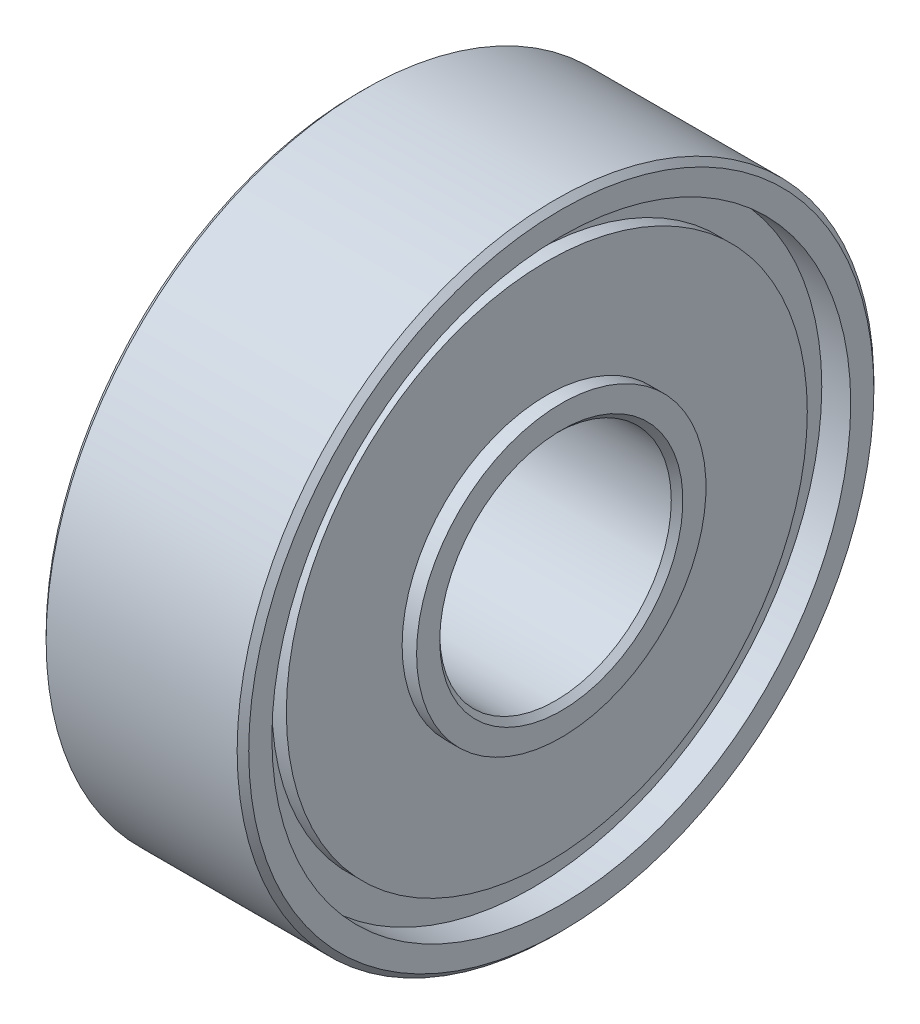
ISO-10303-21;
HEADER;
FILE_DESCRIPTION(('STEP AP214'),'2;1');
FILE_NAME('part.step','',(''),(''),'','','');
FILE_SCHEMA(('AUTOMOTIVE_DESIGN { 1 0 10303 214 1 1 1 1 }'));
ENDSEC;
DATA;
#1=APPLICATION_CONTEXT('core data for automotive mechanical design processes');
#2=APPLICATION_PROTOCOL_DEFINITION('international standard','automotive_design',2000,#1);
#3=PRODUCT_CONTEXT('',#1,'mechanical');
#4=PRODUCT('Part','Part','',(#3));
#5=PRODUCT_RELATED_PRODUCT_CATEGORY('part','',(#4));
#6=PRODUCT_DEFINITION_FORMATION('','',#4);
#7=PRODUCT_DEFINITION_CONTEXT('part definition',#1,'design');
#8=PRODUCT_DEFINITION('design','',#6,#7);
#9=PRODUCT_DEFINITION_SHAPE('','',#8);
#10=(LENGTH_UNIT() NAMED_UNIT(*) SI_UNIT(.MILLI.,.METRE.));
#11=(NAMED_UNIT(*) PLANE_ANGLE_UNIT() SI_UNIT($,.RADIAN.));
#12=(NAMED_UNIT(*) SI_UNIT($,.STERADIAN.) SOLID_ANGLE_UNIT());
#13=UNCERTAINTY_MEASURE_WITH_UNIT(LENGTH_MEASURE(1.E-05),#10,'distance_accuracy_value','');
#14=(GEOMETRIC_REPRESENTATION_CONTEXT(3) GLOBAL_UNCERTAINTY_ASSIGNED_CONTEXT((#13)) GLOBAL_UNIT_ASSIGNED_CONTEXT((#10,
#11,#12)) REPRESENTATION_CONTEXT('',''));
#15=CARTESIAN_POINT('',(0.,0.,0.));
#16=DIRECTION('',(0.,0.,1.));
#17=DIRECTION('',(1.,0.,0.));
#18=AXIS2_PLACEMENT_3D('',#15,#16,#17);
#19=CARTESIAN_POINT('',(3.5,4.,0.));
#20=DIRECTION('',(-1.,0.,0.));
#21=DIRECTION('',(0.,0.,1.));
#22=AXIS2_PLACEMENT_3D('',#19,#20,#21);
#23=PLANE('',#22);
#24=CARTESIAN_POINT('',(3.5,0.,0.));
#25=DIRECTION('',(-1.,0.,0.));
#26=DIRECTION('',(0.,0.,1.));
#27=AXIS2_PLACEMENT_3D('',#24,#25,#26);
#28=CIRCLE('',#27,4.19999999999999);
#29=CARTESIAN_POINT('',(3.5,0.,4.19999999999999));
#30=VERTEX_POINT('',#29);
#31=EDGE_CURVE('E64',#30,#30,#28,.T.);
#32=ORIENTED_EDGE('',*,*,#31,.T.);
#33=EDGE_LOOP('',(#32));
#34=FACE_BOUND('',#33,.T.);
#35=CARTESIAN_POINT('',(3.5,0.,0.));
#36=DIRECTION('',(-1.,0.,0.));
#37=DIRECTION('',(0.,0.,1.));
#38=AXIS2_PLACEMENT_3D('',#35,#36,#37);
#39=CIRCLE('',#38,5.);
#40=CARTESIAN_POINT('',(3.5,0.,5.));
#41=VERTEX_POINT('',#40);
#42=EDGE_CURVE('E80',#41,#41,#39,.T.);
#43=ORIENTED_EDGE('',*,*,#42,.F.);
#44=EDGE_LOOP('',(#43));
#45=FACE_BOUND('',#44,.T.);
#46=ADVANCED_FACE('F39',(#34,#45),#23,.F.);
#47=CARTESIAN_POINT('',(-6.47698987793806,0.,0.));
#48=DIRECTION('',(-1.,0.,0.));
#49=DIRECTION('',(0.,0.,1.));
#50=AXIS2_PLACEMENT_3D('',#47,#48,#49);
#51=CYLINDRICAL_SURFACE('',#50,5.);
#52=CARTESIAN_POINT('',(3.,0.,0.));
#53=DIRECTION('',(-1.,0.,0.));
#54=DIRECTION('',(0.,0.,1.));
#55=AXIS2_PLACEMENT_3D('',#52,#53,#54);
#56=CIRCLE('',#55,5.);
#57=CARTESIAN_POINT('',(3.,0.,5.));
#58=VERTEX_POINT('',#57);
#59=EDGE_CURVE('E84',#58,#58,#56,.T.);
#60=ORIENTED_EDGE('',*,*,#59,.F.);
#61=EDGE_LOOP('',(#60));
#62=FACE_BOUND('',#61,.T.);
#63=ORIENTED_EDGE('',*,*,#42,.T.);
#64=EDGE_LOOP('',(#63));
#65=FACE_BOUND('',#64,.T.);
#66=ADVANCED_FACE('F172',(#62,#65),#51,.T.);
#67=CARTESIAN_POINT('',(3.,5.,0.));
#68=DIRECTION('',(-1.,0.,0.));
#69=DIRECTION('',(0.,0.,1.));
#70=AXIS2_PLACEMENT_3D('',#67,#68,#69);
#71=PLANE('',#70);
#72=CARTESIAN_POINT('',(3.,0.,0.));
#73=DIRECTION('',(-1.,0.,0.));
#74=DIRECTION('',(0.,0.,1.));
#75=AXIS2_PLACEMENT_3D('',#72,#73,#74);
#76=CIRCLE('',#75,9.);
#77=CARTESIAN_POINT('',(3.,0.,9.));
#78=VERTEX_POINT('',#77);
#79=EDGE_CURVE('E88',#78,#78,#76,.T.);
#80=ORIENTED_EDGE('',*,*,#79,.F.);
#81=EDGE_LOOP('',(#80));
#82=FACE_BOUND('',#81,.T.);
#83=ORIENTED_EDGE('',*,*,#59,.T.);
#84=EDGE_LOOP('',(#83));
#85=FACE_BOUND('',#84,.T.);
#86=ADVANCED_FACE('F178',(#82,#85),#71,.F.);
#87=CARTESIAN_POINT('',(-6.47698987793806,0.,0.));
#88=DIRECTION('',(-1.,0.,0.));
#89=DIRECTION('',(0.,0.,1.));
#90=AXIS2_PLACEMENT_3D('',#87,#88,#89);
#91=CYLINDRICAL_SURFACE('',#90,9.);
#92=CARTESIAN_POINT('',(2.5,0.,0.));
#93=DIRECTION('',(-1.,0.,0.));
#94=DIRECTION('',(0.,0.,1.));
#95=AXIS2_PLACEMENT_3D('',#92,#93,#94);
#96=CIRCLE('',#95,9.);
#97=CARTESIAN_POINT('',(2.5,0.,9.));
#98=VERTEX_POINT('',#97);
#99=EDGE_CURVE('E92',#98,#98,#96,.T.);
#100=ORIENTED_EDGE('',*,*,#99,.F.);
#101=EDGE_LOOP('',(#100));
#102=FACE_BOUND('',#101,.T.);
#103=ORIENTED_EDGE('',*,*,#79,.T.);
#104=EDGE_LOOP('',(#103));
#105=FACE_BOUND('',#104,.T.);
#106=ADVANCED_FACE('F322',(#102,#105),#91,.T.);
#107=CARTESIAN_POINT('',(2.5,9.,0.));
#108=DIRECTION('',(-1.,0.,0.));
#109=DIRECTION('',(0.,0.,1.));
#110=AXIS2_PLACEMENT_3D('',#107,#108,#109);
#111=PLANE('',#110);
#112=CARTESIAN_POINT('',(2.5,0.,0.));
#113=DIRECTION('',(-1.,0.,0.));
#114=DIRECTION('',(0.,0.,1.));
#115=AXIS2_PLACEMENT_3D('',#112,#113,#114);
#116=CIRCLE('',#115,10.);
#117=CARTESIAN_POINT('',(2.5,0.,10.));
#118=VERTEX_POINT('',#117);
#119=EDGE_CURVE('E96',#118,#118,#116,.T.);
#120=ORIENTED_EDGE('',*,*,#119,.F.);
#121=EDGE_LOOP('',(#120));
#122=FACE_BOUND('',#121,.T.);
#123=ORIENTED_EDGE('',*,*,#99,.T.);
#124=EDGE_LOOP('',(#123));
#125=FACE_BOUND('',#124,.T.);
#126=ADVANCED_FACE('F312',(#122,#125),#111,.F.);
#127=CARTESIAN_POINT('',(-6.47698987793806,0.,0.));
#128=DIRECTION('',(-1.,0.,0.));
#129=DIRECTION('',(0.,0.,1.));
#130=AXIS2_PLACEMENT_3D('',#127,#128,#129);
#131=CYLINDRICAL_SURFACE('',#130,10.);
#132=CARTESIAN_POINT('',(3.5,0.,0.));
#133=DIRECTION('',(-1.,0.,0.));
#134=DIRECTION('',(0.,0.,1.));
#135=AXIS2_PLACEMENT_3D('',#132,#133,#134);
#136=CIRCLE('',#135,10.);
#137=CARTESIAN_POINT('',(3.5,0.,10.));
#138=VERTEX_POINT('',#137);
#139=EDGE_CURVE('E100',#138,#138,#136,.T.);
#140=ORIENTED_EDGE('',*,*,#139,.F.);
#141=EDGE_LOOP('',(#140));
#142=FACE_BOUND('',#141,.T.);
#143=ORIENTED_EDGE('',*,*,#119,.T.);
#144=EDGE_LOOP('',(#143));
#145=FACE_BOUND('',#144,.T.);
#146=ADVANCED_FACE('F269',(#142,#145),#131,.F.);
#147=CARTESIAN_POINT('',(3.5,10.,0.));
#148=DIRECTION('',(-1.,0.,0.));
#149=DIRECTION('',(0.,0.,1.));
#150=AXIS2_PLACEMENT_3D('',#147,#148,#149);
#151=PLANE('',#150);
#152=CARTESIAN_POINT('',(3.5,0.,0.));
#153=DIRECTION('',(-1.,0.,0.));
#154=DIRECTION('',(0.,0.,1.));
#155=AXIS2_PLACEMENT_3D('',#152,#153,#154);
#156=CIRCLE('',#155,10.8);
#157=CARTESIAN_POINT('',(3.5,0.,10.8));
#158=VERTEX_POINT('',#157);
#159=EDGE_CURVE('E48',#158,#158,#156,.F.);
#160=ORIENTED_EDGE('',*,*,#159,.T.);
#161=EDGE_LOOP('',(#160));
#162=FACE_BOUND('',#161,.T.);
#163=ORIENTED_EDGE('',*,*,#139,.T.);
#164=EDGE_LOOP('',(#163));
#165=FACE_BOUND('',#164,.T.);
#166=ADVANCED_FACE('F168',(#162,#165),#151,.F.);
#167=CARTESIAN_POINT('',(-6.47698987793806,0.,0.));
#168=DIRECTION('',(-1.,0.,0.));
#169=DIRECTION('',(0.,0.,1.));
#170=AXIS2_PLACEMENT_3D('',#167,#168,#169);
#171=CYLINDRICAL_SURFACE('',#170,11.);
#172=CARTESIAN_POINT('',(3.3,0.,0.));
#173=DIRECTION('',(-1.,0.,0.));
#174=DIRECTION('',(0.,0.,1.));
#175=AXIS2_PLACEMENT_3D('',#172,#173,#174);
#176=CIRCLE('',#175,11.);
#177=CARTESIAN_POINT('',(3.3,0.,11.));
#178=VERTEX_POINT('',#177);
#179=EDGE_CURVE('E53',#178,#178,#176,.T.);
#180=ORIENTED_EDGE('',*,*,#179,.T.);
#181=EDGE_LOOP('',(#180));
#182=FACE_BOUND('',#181,.T.);
#183=CARTESIAN_POINT('',(-3.3,0.,0.));
#184=DIRECTION('',(1.,0.,0.));
#185=DIRECTION('',(0.,0.,-1.));
#186=AXIS2_PLACEMENT_3D('',#183,#184,#185);
#187=CIRCLE('',#186,11.);
#188=CARTESIAN_POINT('',(-3.3,0.,-11.));
#189=VERTEX_POINT('',#188);
#190=EDGE_CURVE('E58',#189,#189,#187,.T.);
#191=ORIENTED_EDGE('',*,*,#190,.T.);
#192=EDGE_LOOP('',(#191));
#193=FACE_BOUND('',#192,.T.);
#194=ADVANCED_FACE('F163',(#182,#193),#171,.T.);
#195=CARTESIAN_POINT('',(-3.5,10.,0.));
#196=DIRECTION('',(1.,0.,0.));
#197=DIRECTION('',(0.,0.,-1.));
#198=AXIS2_PLACEMENT_3D('',#195,#196,#197);
#199=PLANE('',#198);
#200=CARTESIAN_POINT('',(-3.5,0.,0.));
#201=DIRECTION('',(1.,0.,0.));
#202=DIRECTION('',(0.,0.,-1.));
#203=AXIS2_PLACEMENT_3D('',#200,#201,#202);
#204=CIRCLE('',#203,10.8);
#205=CARTESIAN_POINT('',(-3.5,0.,-10.8));
#206=VERTEX_POINT('',#205);
#207=EDGE_CURVE('E10',#206,#206,#204,.F.);
#208=ORIENTED_EDGE('',*,*,#207,.T.);
#209=EDGE_LOOP('',(#208));
#210=FACE_BOUND('',#209,.T.);
#211=CARTESIAN_POINT('',(-3.5,0.,0.));
#212=DIRECTION('',(-1.,0.,0.));
#213=DIRECTION('',(0.,0.,1.));
#214=AXIS2_PLACEMENT_3D('',#211,#212,#213);
#215=CIRCLE('',#214,10.);
#216=CARTESIAN_POINT('',(-3.5,0.,10.));
#217=VERTEX_POINT('',#216);
#218=EDGE_CURVE('E104',#217,#217,#215,.T.);
#219=ORIENTED_EDGE('',*,*,#218,.F.);
#220=EDGE_LOOP('',(#219));
#221=FACE_BOUND('',#220,.T.);
#222=ADVANCED_FACE('F158',(#210,#221),#199,.F.);
#223=CARTESIAN_POINT('',(-6.47698987793806,0.,0.));
#224=DIRECTION('',(-1.,0.,0.));
#225=DIRECTION('',(0.,0.,1.));
#226=AXIS2_PLACEMENT_3D('',#223,#224,#225);
#227=CYLINDRICAL_SURFACE('',#226,10.);
#228=CARTESIAN_POINT('',(-2.5,0.,0.));
#229=DIRECTION('',(-1.,0.,0.));
#230=DIRECTION('',(0.,0.,1.));
#231=AXIS2_PLACEMENT_3D('',#228,#229,#230);
#232=CIRCLE('',#231,10.);
#233=CARTESIAN_POINT('',(-2.5,0.,10.));
#234=VERTEX_POINT('',#233);
#235=EDGE_CURVE('E108',#234,#234,#232,.T.);
#236=ORIENTED_EDGE('',*,*,#235,.F.);
#237=EDGE_LOOP('',(#236));
#238=FACE_BOUND('',#237,.T.);
#239=ORIENTED_EDGE('',*,*,#218,.T.);
#240=EDGE_LOOP('',(#239));
#241=FACE_BOUND('',#240,.T.);
#242=ADVANCED_FACE('F152',(#238,#241),#227,.F.);
#243=CARTESIAN_POINT('',(-2.5,9.,0.));
#244=DIRECTION('',(1.,0.,0.));
#245=DIRECTION('',(0.,0.,-1.));
#246=AXIS2_PLACEMENT_3D('',#243,#244,#245);
#247=PLANE('',#246);
#248=CARTESIAN_POINT('',(-2.5,0.,0.));
#249=DIRECTION('',(-1.,0.,0.));
#250=DIRECTION('',(0.,0.,1.));
#251=AXIS2_PLACEMENT_3D('',#248,#249,#250);
#252=CIRCLE('',#251,9.);
#253=CARTESIAN_POINT('',(-2.5,0.,9.));
#254=VERTEX_POINT('',#253);
#255=EDGE_CURVE('E112',#254,#254,#252,.T.);
#256=ORIENTED_EDGE('',*,*,#255,.F.);
#257=EDGE_LOOP('',(#256));
#258=FACE_BOUND('',#257,.T.);
#259=ORIENTED_EDGE('',*,*,#235,.T.);
#260=EDGE_LOOP('',(#259));
#261=FACE_BOUND('',#260,.T.);
#262=ADVANCED_FACE('F146',(#258,#261),#247,.F.);
#263=CARTESIAN_POINT('',(-6.47698987793806,0.,0.));
#264=DIRECTION('',(-1.,0.,0.));
#265=DIRECTION('',(0.,0.,1.));
#266=AXIS2_PLACEMENT_3D('',#263,#264,#265);
#267=CYLINDRICAL_SURFACE('',#266,9.);
#268=CARTESIAN_POINT('',(-3.,0.,0.));
#269=DIRECTION('',(-1.,0.,0.));
#270=DIRECTION('',(0.,0.,1.));
#271=AXIS2_PLACEMENT_3D('',#268,#269,#270);
#272=CIRCLE('',#271,9.);
#273=CARTESIAN_POINT('',(-3.,0.,9.));
#274=VERTEX_POINT('',#273);
#275=EDGE_CURVE('E116',#274,#274,#272,.T.);
#276=ORIENTED_EDGE('',*,*,#275,.F.);
#277=EDGE_LOOP('',(#276));
#278=FACE_BOUND('',#277,.T.);
#279=ORIENTED_EDGE('',*,*,#255,.T.);
#280=EDGE_LOOP('',(#279));
#281=FACE_BOUND('',#280,.T.);
#282=ADVANCED_FACE('F140',(#278,#281),#267,.T.);
#283=CARTESIAN_POINT('',(-3.,5.,0.));
#284=DIRECTION('',(1.,0.,0.));
#285=DIRECTION('',(0.,0.,-1.));
#286=AXIS2_PLACEMENT_3D('',#283,#284,#285);
#287=PLANE('',#286);
#288=CARTESIAN_POINT('',(-3.,0.,0.));
#289=DIRECTION('',(-1.,0.,0.));
#290=DIRECTION('',(0.,0.,1.));
#291=AXIS2_PLACEMENT_3D('',#288,#289,#290);
#292=CIRCLE('',#291,5.);
#293=CARTESIAN_POINT('',(-3.,0.,5.));
#294=VERTEX_POINT('',#293);
#295=EDGE_CURVE('E120',#294,#294,#292,.T.);
#296=ORIENTED_EDGE('',*,*,#295,.F.);
#297=EDGE_LOOP('',(#296));
#298=FACE_BOUND('',#297,.T.);
#299=ORIENTED_EDGE('',*,*,#275,.T.);
#300=EDGE_LOOP('',(#299));
#301=FACE_BOUND('',#300,.T.);
#302=ADVANCED_FACE('F134',(#298,#301),#287,.F.);
#303=CARTESIAN_POINT('',(-6.47698987793806,0.,0.));
#304=DIRECTION('',(-1.,0.,0.));
#305=DIRECTION('',(0.,0.,1.));
#306=AXIS2_PLACEMENT_3D('',#303,#304,#305);
#307=CYLINDRICAL_SURFACE('',#306,5.);
#308=CARTESIAN_POINT('',(-3.5,0.,0.));
#309=DIRECTION('',(-1.,0.,0.));
#310=DIRECTION('',(0.,0.,1.));
#311=AXIS2_PLACEMENT_3D('',#308,#309,#310);
#312=CIRCLE('',#311,5.);
#313=CARTESIAN_POINT('',(-3.5,0.,5.));
#314=VERTEX_POINT('',#313);
#315=EDGE_CURVE('E124',#314,#314,#312,.T.);
#316=ORIENTED_EDGE('',*,*,#315,.F.);
#317=EDGE_LOOP('',(#316));
#318=FACE_BOUND('',#317,.T.);
#319=ORIENTED_EDGE('',*,*,#295,.T.);
#320=EDGE_LOOP('',(#319));
#321=FACE_BOUND('',#320,.T.);
#322=ADVANCED_FACE('F131',(#318,#321),#307,.T.);
#323=CARTESIAN_POINT('',(-3.5,4.,0.));
#324=DIRECTION('',(1.,0.,0.));
#325=DIRECTION('',(0.,0.,-1.));
#326=AXIS2_PLACEMENT_3D('',#323,#324,#325);
#327=PLANE('',#326);
#328=CARTESIAN_POINT('',(-3.5,0.,0.));
#329=DIRECTION('',(1.,0.,0.));
#330=DIRECTION('',(0.,0.,-1.));
#331=AXIS2_PLACEMENT_3D('',#328,#329,#330);
#332=CIRCLE('',#331,4.2);
#333=CARTESIAN_POINT('',(-3.5,0.,4.2));
#334=VERTEX_POINT('',#333);
#335=EDGE_CURVE('E68',#334,#334,#332,.T.);
#336=ORIENTED_EDGE('',*,*,#335,.T.);
#337=EDGE_LOOP('',(#336));
#338=FACE_BOUND('',#337,.T.);
#339=ORIENTED_EDGE('',*,*,#315,.T.);
#340=EDGE_LOOP('',(#339));
#341=FACE_BOUND('',#340,.T.);
#342=ADVANCED_FACE('F129',(#338,#341),#327,.F.);
#343=CARTESIAN_POINT('',(-6.47698987793806,0.,0.));
#344=DIRECTION('',(-1.,0.,0.));
#345=DIRECTION('',(0.,0.,1.));
#346=AXIS2_PLACEMENT_3D('',#343,#344,#345);
#347=CYLINDRICAL_SURFACE('',#346,4.);
#348=CARTESIAN_POINT('',(-3.3,0.,0.));
#349=DIRECTION('',(1.,0.,0.));
#350=DIRECTION('',(0.,0.,-1.));
#351=AXIS2_PLACEMENT_3D('',#348,#349,#350);
#352=CIRCLE('',#351,4.);
#353=CARTESIAN_POINT('',(-3.3,0.,4.));
#354=VERTEX_POINT('',#353);
#355=EDGE_CURVE('E72',#354,#354,#352,.F.);
#356=ORIENTED_EDGE('',*,*,#355,.T.);
#357=EDGE_LOOP('',(#356));
#358=FACE_BOUND('',#357,.T.);
#359=CARTESIAN_POINT('',(3.3,0.,0.));
#360=DIRECTION('',(-1.,0.,0.));
#361=DIRECTION('',(0.,0.,1.));
#362=AXIS2_PLACEMENT_3D('',#359,#360,#361);
#363=CIRCLE('',#362,4.);
#364=CARTESIAN_POINT('',(3.3,0.,4.));
#365=VERTEX_POINT('',#364);
#366=EDGE_CURVE('E76',#365,#365,#363,.F.);
#367=ORIENTED_EDGE('',*,*,#366,.T.);
#368=EDGE_LOOP('',(#367));
#369=FACE_BOUND('',#368,.T.);
#370=ADVANCED_FACE('F192',(#358,#369),#347,.F.);
#371=CARTESIAN_POINT('',(-3.3,0.,0.));
#372=DIRECTION('',(-1.,0.,0.));
#373=DIRECTION('',(0.,0.,1.));
#374=AXIS2_PLACEMENT_3D('',#371,#372,#373);
#375=CONICAL_SURFACE('',#374,4.,0.785398163397446);
#376=CARTESIAN_POINT('',(-3.5,0.,4.2));
#377=CARTESIAN_POINT('',(-3.49791666666667,0.,4.19791666666667));
#378=CARTESIAN_POINT('',(-3.49583333333333,0.,4.19583333333333));
#379=CARTESIAN_POINT('',(-3.49166666666667,0.,4.19166666666667));
#380=CARTESIAN_POINT('',(-3.48958333333333,0.,4.18958333333333));
#381=CARTESIAN_POINT('',(-3.48541666666667,0.,4.18541666666667));
#382=CARTESIAN_POINT('',(-3.48333333333333,0.,4.18333333333333));
#383=CARTESIAN_POINT('',(-3.47916666666667,0.,4.17916666666667));
#384=CARTESIAN_POINT('',(-3.47708333333333,0.,4.17708333333333));
#385=CARTESIAN_POINT('',(-3.47291666666667,0.,4.17291666666667));
#386=CARTESIAN_POINT('',(-3.47083333333333,0.,4.17083333333333));
#387=CARTESIAN_POINT('',(-3.46666666666667,0.,4.16666666666667));
#388=CARTESIAN_POINT('',(-3.46458333333333,0.,4.16458333333333));
#389=CARTESIAN_POINT('',(-3.46041666666667,0.,4.16041666666667));
#390=CARTESIAN_POINT('',(-3.45833333333333,0.,4.15833333333333));
#391=CARTESIAN_POINT('',(-3.45416666666667,0.,4.15416666666667));
#392=CARTESIAN_POINT('',(-3.45208333333333,0.,4.15208333333333));
#393=CARTESIAN_POINT('',(-3.44791666666667,0.,4.14791666666667));
#394=CARTESIAN_POINT('',(-3.44583333333333,0.,4.14583333333333));
#395=CARTESIAN_POINT('',(-3.44166666666667,0.,4.14166666666667));
#396=CARTESIAN_POINT('',(-3.43958333333333,0.,4.13958333333333));
#397=CARTESIAN_POINT('',(-3.43541666666667,0.,4.13541666666667));
#398=CARTESIAN_POINT('',(-3.43333333333333,0.,4.13333333333333));
#399=CARTESIAN_POINT('',(-3.42916666666667,0.,4.12916666666667));
#400=CARTESIAN_POINT('',(-3.42708333333333,0.,4.12708333333333));
#401=CARTESIAN_POINT('',(-3.42291666666667,0.,4.12291666666667));
#402=CARTESIAN_POINT('',(-3.42083333333333,0.,4.12083333333333));
#403=CARTESIAN_POINT('',(-3.41666666666667,0.,4.11666666666667));
#404=CARTESIAN_POINT('',(-3.41458333333333,0.,4.11458333333333));
#405=CARTESIAN_POINT('',(-3.41041666666667,0.,4.11041666666667));
#406=CARTESIAN_POINT('',(-3.40833333333333,0.,4.10833333333333));
#407=CARTESIAN_POINT('',(-3.40416666666667,0.,4.10416666666667));
#408=CARTESIAN_POINT('',(-3.40208333333333,0.,4.10208333333333));
#409=CARTESIAN_POINT('',(-3.39791666666667,0.,4.09791666666667));
#410=CARTESIAN_POINT('',(-3.39583333333333,0.,4.09583333333333));
#411=CARTESIAN_POINT('',(-3.39166666666667,0.,4.09166666666667));
#412=CARTESIAN_POINT('',(-3.38958333333333,0.,4.08958333333333));
#413=CARTESIAN_POINT('',(-3.38541666666667,0.,4.08541666666667));
#414=CARTESIAN_POINT('',(-3.38333333333333,0.,4.08333333333333));
#415=CARTESIAN_POINT('',(-3.37916666666667,0.,4.07916666666667));
#416=CARTESIAN_POINT('',(-3.37708333333333,0.,4.07708333333333));
#417=CARTESIAN_POINT('',(-3.37291666666667,0.,4.07291666666667));
#418=CARTESIAN_POINT('',(-3.37083333333333,0.,4.07083333333333));
#419=CARTESIAN_POINT('',(-3.36666666666667,0.,4.06666666666667));
#420=CARTESIAN_POINT('',(-3.36458333333333,0.,4.06458333333333));
#421=CARTESIAN_POINT('',(-3.36041666666667,0.,4.06041666666667));
#422=CARTESIAN_POINT('',(-3.35833333333333,0.,4.05833333333333));
#423=CARTESIAN_POINT('',(-3.35416666666667,0.,4.05416666666667));
#424=CARTESIAN_POINT('',(-3.35208333333333,0.,4.05208333333333));
#425=CARTESIAN_POINT('',(-3.34791666666667,0.,4.04791666666667));
#426=CARTESIAN_POINT('',(-3.34583333333333,0.,4.04583333333333));
#427=CARTESIAN_POINT('',(-3.34166666666667,0.,4.04166666666667));
#428=CARTESIAN_POINT('',(-3.33958333333333,0.,4.03958333333333));
#429=CARTESIAN_POINT('',(-3.33541666666667,0.,4.03541666666667));
#430=CARTESIAN_POINT('',(-3.33333333333333,0.,4.03333333333333));
#431=CARTESIAN_POINT('',(-3.32916666666667,0.,4.02916666666667));
#432=CARTESIAN_POINT('',(-3.32708333333333,0.,4.02708333333333));
#433=CARTESIAN_POINT('',(-3.32291666666667,0.,4.02291666666667));
#434=CARTESIAN_POINT('',(-3.32083333333333,0.,4.02083333333333));
#435=CARTESIAN_POINT('',(-3.31666666666667,0.,4.01666666666667));
#436=CARTESIAN_POINT('',(-3.31458333333333,0.,4.01458333333333));
#437=CARTESIAN_POINT('',(-3.31041666666667,0.,4.01041666666667));
#438=CARTESIAN_POINT('',(-3.30833333333333,0.,4.00833333333333));
#439=CARTESIAN_POINT('',(-3.30416666666667,0.,4.00416666666667));
#440=CARTESIAN_POINT('',(-3.30208333333333,0.,4.00208333333333));
#441=CARTESIAN_POINT('',(-3.3,0.,4.));
#442=B_SPLINE_CURVE_WITH_KNOTS('',3,(#376,#377,#378,#379,#380,#381,#382,#383,#384,#385,#386,
#387,#388,#389,#390,#391,#392,#393,#394,#395,#396,#397,#398,#399,#400,#401,#402,#403,#404,#405,
#406,#407,#408,#409,#410,#411,#412,#413,#414,#415,#416,#417,#418,#419,#420,#421,#422,#423,#424,
#425,#426,#427,#428,#429,#430,#431,#432,#433,#434,#435,#436,#437,#438,#439,#440,#441),
.UNSPECIFIED.,.F.,.F.,(4,2,2,2,2,2,2,2,2,2,2,2,2,2,2,2,2,2,2,2,2,2,2,2,2,2,2,2,2,2,2,2,4),(0.,
0.00883883476483148,0.0176776695296636,0.0265165042944954,0.0353553390593275,0.0441941738241586,
0.0530330085889907,0.0618718433538225,0.0707106781186546,0.0795495128834861,0.0883883476483179,
0.09722718241315,0.106066017177982,0.114904851942813,0.123743686707645,0.132582521472477,
0.141421356237309,0.15026019100214,0.159099025766973,0.167937860531804,0.176776695296636,
0.185615530061468,0.1944543648263,0.203293199591132,0.212132034355964,0.220970869120796,
0.229809703885627,0.238648538650459,0.247487373415291,0.256326208180123,0.265165042944954,
0.274003877709786,0.282842712474618),.UNSPECIFIED.);
#443=EDGE_CURVE('BSEAM185',#334,#354,#442,.T.);
#444=ORIENTED_EDGE('',*,*,#335,.F.);
#445=ORIENTED_EDGE('',*,*,#355,.F.);
#446=ORIENTED_EDGE('',*,*,#443,.T.);
#447=ORIENTED_EDGE('',*,*,#443,.F.);
#448=EDGE_LOOP('',(#444,#446,#445,#447));
#449=FACE_BOUND('',#448,.T.);
#450=ADVANCED_FACE('F185',(#449),#375,.F.);
#451=CARTESIAN_POINT('',(3.5,0.,0.));
#452=DIRECTION('',(1.,0.,0.));
#453=DIRECTION('',(0.,0.,-1.));
#454=AXIS2_PLACEMENT_3D('',#451,#452,#453);
#455=CONICAL_SURFACE('',#454,4.2,0.78539816339744);
#456=ORIENTED_EDGE('',*,*,#366,.F.);
#457=EDGE_LOOP('',(#456));
#458=FACE_BOUND('',#457,.T.);
#459=ORIENTED_EDGE('',*,*,#31,.F.);
#460=EDGE_LOOP('',(#459));
#461=FACE_BOUND('',#460,.T.);
#462=ADVANCED_FACE('F191',(#458,#461),#455,.F.);
#463=CARTESIAN_POINT('',(3.3,0.,0.));
#464=DIRECTION('',(-1.,0.,0.));
#465=DIRECTION('',(0.,0.,1.));
#466=AXIS2_PLACEMENT_3D('',#463,#464,#465);
#467=CONICAL_SURFACE('',#466,11.,0.785398163397448);
#468=ORIENTED_EDGE('',*,*,#159,.F.);
#469=EDGE_LOOP('',(#468));
#470=FACE_BOUND('',#469,.T.);
#471=ORIENTED_EDGE('',*,*,#179,.F.);
#472=EDGE_LOOP('',(#471));
#473=FACE_BOUND('',#472,.T.);
#474=ADVANCED_FACE('F198',(#470,#473),#467,.T.);
#475=CARTESIAN_POINT('',(-3.5,0.,0.));
#476=DIRECTION('',(1.,0.,0.));
#477=DIRECTION('',(0.,0.,-1.));
#478=AXIS2_PLACEMENT_3D('',#475,#476,#477);
#479=CONICAL_SURFACE('',#478,10.8,0.785398163397466);
#480=ORIENTED_EDGE('',*,*,#190,.F.);
#481=EDGE_LOOP('',(#480));
#482=FACE_BOUND('',#481,.T.);
#483=ORIENTED_EDGE('',*,*,#207,.F.);
#484=EDGE_LOOP('',(#483));
#485=FACE_BOUND('',#484,.T.);
#486=ADVANCED_FACE('F42',(#482,#485),#479,.T.);
#487=CLOSED_SHELL('',(#46,#66,#86,#106,#126,#146,#166,#194,#222,#242,#262,#282,#302,#322,#342,
#370,#450,#462,#474,#486));
#488=MANIFOLD_SOLID_BREP('B2',#487);
#489=ADVANCED_BREP_SHAPE_REPRESENTATION('',(#18,#488),#14);
#490=SHAPE_DEFINITION_REPRESENTATION(#9,#489);
ENDSEC;
END-ISO-10303-21;
